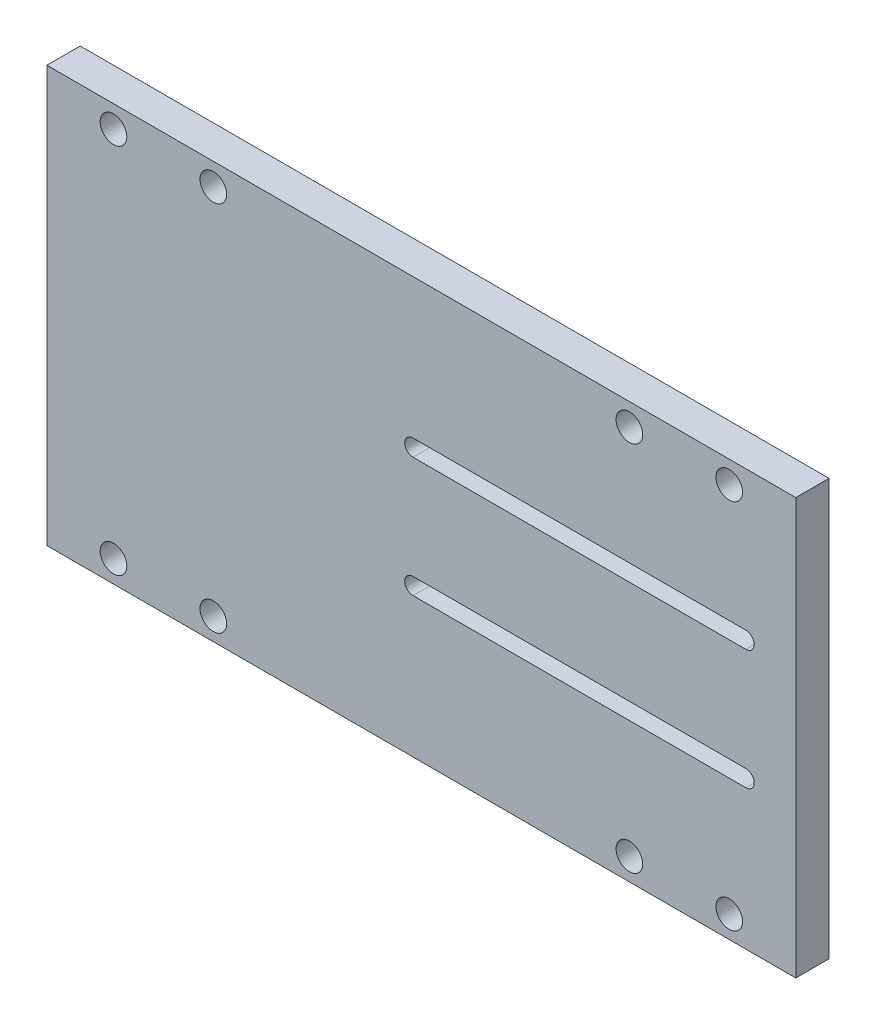
ISO-10303-21;
HEADER;
FILE_DESCRIPTION(('STEP AP214'),'2;1');
FILE_NAME('part.step','',(''),(''),'','','');
FILE_SCHEMA(('AUTOMOTIVE_DESIGN { 1 0 10303 214 1 1 1 1 }'));
ENDSEC;
DATA;
#1=APPLICATION_CONTEXT('core data for automotive mechanical design processes');
#2=APPLICATION_PROTOCOL_DEFINITION('international standard','automotive_design',2000,#1);
#3=PRODUCT_CONTEXT('',#1,'mechanical');
#4=PRODUCT('Part','Part','',(#3));
#5=PRODUCT_RELATED_PRODUCT_CATEGORY('part','',(#4));
#6=PRODUCT_DEFINITION_FORMATION('','',#4);
#7=PRODUCT_DEFINITION_CONTEXT('part definition',#1,'design');
#8=PRODUCT_DEFINITION('design','',#6,#7);
#9=PRODUCT_DEFINITION_SHAPE('','',#8);
#10=(LENGTH_UNIT() NAMED_UNIT(*) SI_UNIT(.MILLI.,.METRE.));
#11=(NAMED_UNIT(*) PLANE_ANGLE_UNIT() SI_UNIT($,.RADIAN.));
#12=(NAMED_UNIT(*) SI_UNIT($,.STERADIAN.) SOLID_ANGLE_UNIT());
#13=UNCERTAINTY_MEASURE_WITH_UNIT(LENGTH_MEASURE(1.E-05),#10,'distance_accuracy_value','');
#14=(GEOMETRIC_REPRESENTATION_CONTEXT(3) GLOBAL_UNCERTAINTY_ASSIGNED_CONTEXT((#13)) GLOBAL_UNIT_ASSIGNED_CONTEXT((#10,
#11,#12)) REPRESENTATION_CONTEXT('',''));
#15=CARTESIAN_POINT('',(0.,0.,0.));
#16=DIRECTION('',(0.,0.,1.));
#17=DIRECTION('',(1.,0.,0.));
#18=AXIS2_PLACEMENT_3D('',#15,#16,#17);
#19=CARTESIAN_POINT('',(0.,0.,5.08));
#20=DIRECTION('',(0.,0.,-1.));
#21=DIRECTION('',(-1.,0.,0.));
#22=AXIS2_PLACEMENT_3D('',#19,#20,#21);
#23=PLANE('',#22);
#24=DIRECTION('',(1.,0.,0.));
#25=VECTOR('',#24,1.);
#26=CARTESIAN_POINT('',(106.68,23.876,5.08));
#27=LINE('',#26,#25);
#28=CARTESIAN_POINT('',(55.88,23.876,5.08));
#29=VERTEX_POINT('',#28);
#30=CARTESIAN_POINT('',(106.68,23.876,5.08));
#31=VERTEX_POINT('',#30);
#32=EDGE_CURVE('E130',#29,#31,#27,.T.);
#33=ORIENTED_EDGE('',*,*,#32,.T.);
#34=CARTESIAN_POINT('',(106.68,22.606,5.08));
#35=DIRECTION('',(0.,0.,-1.));
#36=DIRECTION('',(1.,0.,0.));
#37=AXIS2_PLACEMENT_3D('',#34,#35,#36);
#38=CIRCLE('',#37,1.26999999999999);
#39=CARTESIAN_POINT('',(106.68,21.336,5.08));
#40=VERTEX_POINT('',#39);
#41=EDGE_CURVE('E124',#31,#40,#38,.T.);
#42=ORIENTED_EDGE('',*,*,#41,.T.);
#43=DIRECTION('',(-1.,0.,0.));
#44=VECTOR('',#43,1.);
#45=CARTESIAN_POINT('',(106.68,21.336,5.08));
#46=LINE('',#45,#44);
#47=CARTESIAN_POINT('',(55.88,21.336,5.08));
#48=VERTEX_POINT('',#47);
#49=EDGE_CURVE('E133',#40,#48,#46,.T.);
#50=ORIENTED_EDGE('',*,*,#49,.T.);
#51=CARTESIAN_POINT('',(55.88,22.606,5.08));
#52=DIRECTION('',(0.,0.,-1.));
#53=DIRECTION('',(-1.,0.,0.));
#54=AXIS2_PLACEMENT_3D('',#51,#52,#53);
#55=CIRCLE('',#54,1.26999999999999);
#56=EDGE_CURVE('E48',#48,#29,#55,.T.);
#57=ORIENTED_EDGE('',*,*,#56,.T.);
#58=EDGE_LOOP('',(#33,#42,#50,#57));
#59=FACE_BOUND('',#58,.T.);
#60=DIRECTION('',(1.,0.,0.));
#61=VECTOR('',#60,1.);
#62=CARTESIAN_POINT('',(106.68,42.164,5.08));
#63=LINE('',#62,#61);
#64=CARTESIAN_POINT('',(55.88,42.164,5.08));
#65=VERTEX_POINT('',#64);
#66=CARTESIAN_POINT('',(106.68,42.164,5.08));
#67=VERTEX_POINT('',#66);
#68=EDGE_CURVE('E168',#65,#67,#63,.T.);
#69=ORIENTED_EDGE('',*,*,#68,.T.);
#70=CARTESIAN_POINT('',(106.68,40.894,5.08));
#71=DIRECTION('',(0.,0.,-1.));
#72=DIRECTION('',(-1.,0.,0.));
#73=AXIS2_PLACEMENT_3D('',#70,#71,#72);
#74=CIRCLE('',#73,1.26999999999999);
#75=CARTESIAN_POINT('',(106.68,39.624,5.08));
#76=VERTEX_POINT('',#75);
#77=EDGE_CURVE('E158',#67,#76,#74,.T.);
#78=ORIENTED_EDGE('',*,*,#77,.T.);
#79=DIRECTION('',(-1.,0.,0.));
#80=VECTOR('',#79,1.);
#81=CARTESIAN_POINT('',(106.68,39.624,5.08));
#82=LINE('',#81,#80);
#83=CARTESIAN_POINT('',(55.88,39.624,5.08));
#84=VERTEX_POINT('',#83);
#85=EDGE_CURVE('E161',#76,#84,#82,.T.);
#86=ORIENTED_EDGE('',*,*,#85,.T.);
#87=CARTESIAN_POINT('',(55.88,40.894,5.08));
#88=DIRECTION('',(0.,0.,-1.));
#89=DIRECTION('',(1.,0.,0.));
#90=AXIS2_PLACEMENT_3D('',#87,#88,#89);
#91=CIRCLE('',#90,1.26999999999999);
#92=EDGE_CURVE('E165',#84,#65,#91,.T.);
#93=ORIENTED_EDGE('',*,*,#92,.T.);
#94=EDGE_LOOP('',(#69,#78,#86,#93));
#95=FACE_BOUND('',#94,.T.);
#96=CARTESIAN_POINT('',(104.14,3.37820000000003,5.08));
#97=DIRECTION('',(0.,0.,1.));
#98=DIRECTION('',(-1.,0.,0.));
#99=AXIS2_PLACEMENT_3D('',#96,#97,#98);
#100=CIRCLE('',#99,2.03200000000001);
#101=CARTESIAN_POINT('',(102.108,3.37820000000003,5.08));
#102=VERTEX_POINT('',#101);
#103=EDGE_CURVE('E196',#102,#102,#100,.T.);
#104=ORIENTED_EDGE('',*,*,#103,.F.);
#105=EDGE_LOOP('',(#104));
#106=FACE_BOUND('',#105,.T.);
#107=CARTESIAN_POINT('',(10.16,60.1218,5.08));
#108=DIRECTION('',(0.,0.,1.));
#109=DIRECTION('',(-1.,0.,0.));
#110=AXIS2_PLACEMENT_3D('',#107,#108,#109);
#111=CIRCLE('',#110,2.032);
#112=CARTESIAN_POINT('',(8.128,60.1218,5.08));
#113=VERTEX_POINT('',#112);
#114=EDGE_CURVE('E208',#113,#113,#111,.T.);
#115=ORIENTED_EDGE('',*,*,#114,.F.);
#116=EDGE_LOOP('',(#115));
#117=FACE_BOUND('',#116,.T.);
#118=CARTESIAN_POINT('',(25.4,3.37820000000003,5.08));
#119=DIRECTION('',(0.,0.,1.));
#120=DIRECTION('',(1.,0.,0.));
#121=AXIS2_PLACEMENT_3D('',#118,#119,#120);
#122=CIRCLE('',#121,2.03200000000001);
#123=CARTESIAN_POINT('',(27.432,3.37820000000003,5.08));
#124=VERTEX_POINT('',#123);
#125=EDGE_CURVE('E220',#124,#124,#122,.T.);
#126=ORIENTED_EDGE('',*,*,#125,.F.);
#127=EDGE_LOOP('',(#126));
#128=FACE_BOUND('',#127,.T.);
#129=CARTESIAN_POINT('',(88.9,60.1218,5.08));
#130=DIRECTION('',(0.,0.,1.));
#131=DIRECTION('',(1.,0.,0.));
#132=AXIS2_PLACEMENT_3D('',#129,#130,#131);
#133=CIRCLE('',#132,2.03200000000001);
#134=CARTESIAN_POINT('',(90.932,60.1218,5.08));
#135=VERTEX_POINT('',#134);
#136=EDGE_CURVE('E232',#135,#135,#133,.T.);
#137=ORIENTED_EDGE('',*,*,#136,.F.);
#138=EDGE_LOOP('',(#137));
#139=FACE_BOUND('',#138,.T.);
#140=DIRECTION('',(0.,-1.,0.));
#141=VECTOR('',#140,1.);
#142=CARTESIAN_POINT('',(0.,0.,5.08));
#143=LINE('',#142,#141);
#144=CARTESIAN_POINT('',(0.,63.5,5.08));
#145=VERTEX_POINT('',#144);
#146=CARTESIAN_POINT('',(0.,0.,5.08));
#147=VERTEX_POINT('',#146);
#148=EDGE_CURVE('E238',#145,#147,#143,.T.);
#149=ORIENTED_EDGE('',*,*,#148,.T.);
#150=DIRECTION('',(1.,0.,0.));
#151=VECTOR('',#150,1.);
#152=CARTESIAN_POINT('',(0.,0.,5.08));
#153=LINE('',#152,#151);
#154=CARTESIAN_POINT('',(114.3,0.,5.08));
#155=VERTEX_POINT('',#154);
#156=EDGE_CURVE('E241',#147,#155,#153,.T.);
#157=ORIENTED_EDGE('',*,*,#156,.T.);
#158=DIRECTION('',(0.,1.,0.));
#159=VECTOR('',#158,1.);
#160=CARTESIAN_POINT('',(114.3,0.,5.08));
#161=LINE('',#160,#159);
#162=CARTESIAN_POINT('',(114.3,63.5,5.08));
#163=VERTEX_POINT('',#162);
#164=EDGE_CURVE('E244',#155,#163,#161,.T.);
#165=ORIENTED_EDGE('',*,*,#164,.T.);
#166=DIRECTION('',(-1.,0.,0.));
#167=VECTOR('',#166,1.);
#168=CARTESIAN_POINT('',(0.,63.5,5.08));
#169=LINE('',#168,#167);
#170=EDGE_CURVE('E246',#163,#145,#169,.T.);
#171=ORIENTED_EDGE('',*,*,#170,.T.);
#172=EDGE_LOOP('',(#149,#157,#165,#171));
#173=FACE_BOUND('',#172,.T.);
#174=CARTESIAN_POINT('',(88.9,3.37820000000001,5.08));
#175=DIRECTION('',(0.,0.,1.));
#176=DIRECTION('',(-1.,0.,0.));
#177=AXIS2_PLACEMENT_3D('',#174,#175,#176);
#178=CIRCLE('',#177,2.03200000000001);
#179=CARTESIAN_POINT('',(86.868,3.37820000000001,5.08));
#180=VERTEX_POINT('',#179);
#181=EDGE_CURVE('E226',#180,#180,#178,.T.);
#182=ORIENTED_EDGE('',*,*,#181,.F.);
#183=EDGE_LOOP('',(#182));
#184=FACE_BOUND('',#183,.T.);
#185=CARTESIAN_POINT('',(25.4,60.1218,5.08));
#186=DIRECTION('',(0.,0.,1.));
#187=DIRECTION('',(-1.,0.,0.));
#188=AXIS2_PLACEMENT_3D('',#185,#186,#187);
#189=CIRCLE('',#188,2.03200000000001);
#190=CARTESIAN_POINT('',(23.368,60.1218,5.08));
#191=VERTEX_POINT('',#190);
#192=EDGE_CURVE('E214',#191,#191,#189,.T.);
#193=ORIENTED_EDGE('',*,*,#192,.F.);
#194=EDGE_LOOP('',(#193));
#195=FACE_BOUND('',#194,.T.);
#196=CARTESIAN_POINT('',(10.16,3.37820000000003,5.08));
#197=DIRECTION('',(0.,0.,1.));
#198=DIRECTION('',(1.,0.,0.));
#199=AXIS2_PLACEMENT_3D('',#196,#197,#198);
#200=CIRCLE('',#199,2.032);
#201=CARTESIAN_POINT('',(12.192,3.37820000000003,5.08));
#202=VERTEX_POINT('',#201);
#203=EDGE_CURVE('E202',#202,#202,#200,.T.);
#204=ORIENTED_EDGE('',*,*,#203,.F.);
#205=EDGE_LOOP('',(#204));
#206=FACE_BOUND('',#205,.T.);
#207=CARTESIAN_POINT('',(104.14,60.1218,5.08));
#208=DIRECTION('',(0.,0.,1.));
#209=DIRECTION('',(1.,0.,0.));
#210=AXIS2_PLACEMENT_3D('',#207,#208,#209);
#211=CIRCLE('',#210,2.03200000000001);
#212=CARTESIAN_POINT('',(106.172,60.1218,5.08));
#213=VERTEX_POINT('',#212);
#214=EDGE_CURVE('E190',#213,#213,#211,.T.);
#215=ORIENTED_EDGE('',*,*,#214,.F.);
#216=EDGE_LOOP('',(#215));
#217=FACE_BOUND('',#216,.T.);
#218=ADVANCED_FACE('F33',(#59,#95,#106,#117,#128,#139,#173,#184,#195,#206,#217),#23,.F.);
#219=CARTESIAN_POINT('',(0.,0.,0.));
#220=DIRECTION('',(0.,0.,-1.));
#221=DIRECTION('',(-1.,0.,0.));
#222=AXIS2_PLACEMENT_3D('',#219,#220,#221);
#223=PLANE('',#222);
#224=CARTESIAN_POINT('',(106.68,22.606,0.));
#225=DIRECTION('',(0.,0.,-1.));
#226=DIRECTION('',(1.,0.,0.));
#227=AXIS2_PLACEMENT_3D('',#224,#225,#226);
#228=CIRCLE('',#227,1.26999999999999);
#229=CARTESIAN_POINT('',(106.68,23.876,0.));
#230=VERTEX_POINT('',#229);
#231=CARTESIAN_POINT('',(106.68,21.336,0.));
#232=VERTEX_POINT('',#231);
#233=EDGE_CURVE('E56',#230,#232,#228,.T.);
#234=ORIENTED_EDGE('',*,*,#233,.F.);
#235=DIRECTION('',(1.,0.,0.));
#236=VECTOR('',#235,1.);
#237=CARTESIAN_POINT('',(106.68,23.876,0.));
#238=LINE('',#237,#236);
#239=CARTESIAN_POINT('',(55.88,23.876,0.));
#240=VERTEX_POINT('',#239);
#241=EDGE_CURVE('E139',#240,#230,#238,.T.);
#242=ORIENTED_EDGE('',*,*,#241,.F.);
#243=CARTESIAN_POINT('',(55.88,22.606,0.));
#244=DIRECTION('',(0.,0.,-1.));
#245=DIRECTION('',(-1.,0.,0.));
#246=AXIS2_PLACEMENT_3D('',#243,#244,#245);
#247=CIRCLE('',#246,1.26999999999999);
#248=CARTESIAN_POINT('',(55.88,21.336,0.));
#249=VERTEX_POINT('',#248);
#250=EDGE_CURVE('E142',#249,#240,#247,.T.);
#251=ORIENTED_EDGE('',*,*,#250,.F.);
#252=DIRECTION('',(-1.,0.,0.));
#253=VECTOR('',#252,1.);
#254=CARTESIAN_POINT('',(106.68,21.336,0.));
#255=LINE('',#254,#253);
#256=EDGE_CURVE('E148',#232,#249,#255,.T.);
#257=ORIENTED_EDGE('',*,*,#256,.F.);
#258=EDGE_LOOP('',(#234,#242,#251,#257));
#259=FACE_BOUND('',#258,.T.);
#260=CARTESIAN_POINT('',(106.68,40.894,0.));
#261=DIRECTION('',(0.,0.,-1.));
#262=DIRECTION('',(-1.,0.,0.));
#263=AXIS2_PLACEMENT_3D('',#260,#261,#262);
#264=CIRCLE('',#263,1.26999999999999);
#265=CARTESIAN_POINT('',(106.68,42.164,0.));
#266=VERTEX_POINT('',#265);
#267=CARTESIAN_POINT('',(106.68,39.624,0.));
#268=VERTEX_POINT('',#267);
#269=EDGE_CURVE('E154',#266,#268,#264,.T.);
#270=ORIENTED_EDGE('',*,*,#269,.F.);
#271=DIRECTION('',(1.,0.,0.));
#272=VECTOR('',#271,1.);
#273=CARTESIAN_POINT('',(106.68,42.164,0.));
#274=LINE('',#273,#272);
#275=CARTESIAN_POINT('',(55.88,42.164,0.));
#276=VERTEX_POINT('',#275);
#277=EDGE_CURVE('E162',#276,#266,#274,.T.);
#278=ORIENTED_EDGE('',*,*,#277,.F.);
#279=CARTESIAN_POINT('',(55.88,40.894,0.));
#280=DIRECTION('',(0.,0.,-1.));
#281=DIRECTION('',(1.,0.,0.));
#282=AXIS2_PLACEMENT_3D('',#279,#280,#281);
#283=CIRCLE('',#282,1.26999999999999);
#284=CARTESIAN_POINT('',(55.88,39.624,0.));
#285=VERTEX_POINT('',#284);
#286=EDGE_CURVE('E176',#285,#276,#283,.T.);
#287=ORIENTED_EDGE('',*,*,#286,.F.);
#288=DIRECTION('',(-1.,0.,0.));
#289=VECTOR('',#288,1.);
#290=CARTESIAN_POINT('',(106.68,39.624,0.));
#291=LINE('',#290,#289);
#292=EDGE_CURVE('E173',#268,#285,#291,.T.);
#293=ORIENTED_EDGE('',*,*,#292,.F.);
#294=EDGE_LOOP('',(#270,#278,#287,#293));
#295=FACE_BOUND('',#294,.T.);
#296=CARTESIAN_POINT('',(104.14,3.37820000000003,0.));
#297=DIRECTION('',(0.,0.,1.));
#298=DIRECTION('',(-1.,0.,0.));
#299=AXIS2_PLACEMENT_3D('',#296,#297,#298);
#300=CIRCLE('',#299,2.03200000000001);
#301=CARTESIAN_POINT('',(102.108,3.37820000000003,0.));
#302=VERTEX_POINT('',#301);
#303=EDGE_CURVE('E193',#302,#302,#300,.T.);
#304=ORIENTED_EDGE('',*,*,#303,.T.);
#305=EDGE_LOOP('',(#304));
#306=FACE_BOUND('',#305,.T.);
#307=CARTESIAN_POINT('',(10.16,60.1218,0.));
#308=DIRECTION('',(0.,0.,1.));
#309=DIRECTION('',(-1.,0.,0.));
#310=AXIS2_PLACEMENT_3D('',#307,#308,#309);
#311=CIRCLE('',#310,2.032);
#312=CARTESIAN_POINT('',(8.128,60.1218,0.));
#313=VERTEX_POINT('',#312);
#314=EDGE_CURVE('E205',#313,#313,#311,.T.);
#315=ORIENTED_EDGE('',*,*,#314,.T.);
#316=EDGE_LOOP('',(#315));
#317=FACE_BOUND('',#316,.T.);
#318=CARTESIAN_POINT('',(25.4,3.37820000000003,0.));
#319=DIRECTION('',(0.,0.,1.));
#320=DIRECTION('',(1.,0.,0.));
#321=AXIS2_PLACEMENT_3D('',#318,#319,#320);
#322=CIRCLE('',#321,2.03200000000001);
#323=CARTESIAN_POINT('',(27.432,3.37820000000003,0.));
#324=VERTEX_POINT('',#323);
#325=EDGE_CURVE('E217',#324,#324,#322,.T.);
#326=ORIENTED_EDGE('',*,*,#325,.T.);
#327=EDGE_LOOP('',(#326));
#328=FACE_BOUND('',#327,.T.);
#329=CARTESIAN_POINT('',(88.9,60.1218,0.));
#330=DIRECTION('',(0.,0.,1.));
#331=DIRECTION('',(1.,0.,0.));
#332=AXIS2_PLACEMENT_3D('',#329,#330,#331);
#333=CIRCLE('',#332,2.03200000000001);
#334=CARTESIAN_POINT('',(90.932,60.1218,0.));
#335=VERTEX_POINT('',#334);
#336=EDGE_CURVE('E229',#335,#335,#333,.T.);
#337=ORIENTED_EDGE('',*,*,#336,.T.);
#338=EDGE_LOOP('',(#337));
#339=FACE_BOUND('',#338,.T.);
#340=DIRECTION('',(0.,-1.,0.));
#341=VECTOR('',#340,1.);
#342=CARTESIAN_POINT('',(0.,0.,0.));
#343=LINE('',#342,#341);
#344=CARTESIAN_POINT('',(0.,63.5,0.));
#345=VERTEX_POINT('',#344);
#346=CARTESIAN_POINT('',(0.,0.,0.));
#347=VERTEX_POINT('',#346);
#348=EDGE_CURVE('E235',#345,#347,#343,.T.);
#349=ORIENTED_EDGE('',*,*,#348,.F.);
#350=DIRECTION('',(-1.,0.,0.));
#351=VECTOR('',#350,1.);
#352=CARTESIAN_POINT('',(0.,63.5,0.));
#353=LINE('',#352,#351);
#354=CARTESIAN_POINT('',(114.3,63.5,0.));
#355=VERTEX_POINT('',#354);
#356=EDGE_CURVE('E242',#355,#345,#353,.T.);
#357=ORIENTED_EDGE('',*,*,#356,.F.);
#358=DIRECTION('',(0.,1.,0.));
#359=VECTOR('',#358,1.);
#360=CARTESIAN_POINT('',(114.3,0.,0.));
#361=LINE('',#360,#359);
#362=CARTESIAN_POINT('',(114.3,0.,0.));
#363=VERTEX_POINT('',#362);
#364=EDGE_CURVE('E253',#363,#355,#361,.T.);
#365=ORIENTED_EDGE('',*,*,#364,.F.);
#366=DIRECTION('',(1.,0.,0.));
#367=VECTOR('',#366,1.);
#368=CARTESIAN_POINT('',(0.,0.,0.));
#369=LINE('',#368,#367);
#370=EDGE_CURVE('E251',#347,#363,#369,.T.);
#371=ORIENTED_EDGE('',*,*,#370,.F.);
#372=EDGE_LOOP('',(#349,#357,#365,#371));
#373=FACE_BOUND('',#372,.T.);
#374=CARTESIAN_POINT('',(88.9,3.37820000000001,0.));
#375=DIRECTION('',(0.,0.,1.));
#376=DIRECTION('',(-1.,0.,0.));
#377=AXIS2_PLACEMENT_3D('',#374,#375,#376);
#378=CIRCLE('',#377,2.03200000000001);
#379=CARTESIAN_POINT('',(86.868,3.37820000000001,0.));
#380=VERTEX_POINT('',#379);
#381=EDGE_CURVE('E223',#380,#380,#378,.T.);
#382=ORIENTED_EDGE('',*,*,#381,.T.);
#383=EDGE_LOOP('',(#382));
#384=FACE_BOUND('',#383,.T.);
#385=CARTESIAN_POINT('',(25.4,60.1218,0.));
#386=DIRECTION('',(0.,0.,1.));
#387=DIRECTION('',(-1.,0.,0.));
#388=AXIS2_PLACEMENT_3D('',#385,#386,#387);
#389=CIRCLE('',#388,2.03200000000001);
#390=CARTESIAN_POINT('',(23.368,60.1218,0.));
#391=VERTEX_POINT('',#390);
#392=EDGE_CURVE('E211',#391,#391,#389,.T.);
#393=ORIENTED_EDGE('',*,*,#392,.T.);
#394=EDGE_LOOP('',(#393));
#395=FACE_BOUND('',#394,.T.);
#396=CARTESIAN_POINT('',(10.16,3.37820000000003,0.));
#397=DIRECTION('',(0.,0.,1.));
#398=DIRECTION('',(1.,0.,0.));
#399=AXIS2_PLACEMENT_3D('',#396,#397,#398);
#400=CIRCLE('',#399,2.032);
#401=CARTESIAN_POINT('',(12.192,3.37820000000003,0.));
#402=VERTEX_POINT('',#401);
#403=EDGE_CURVE('E199',#402,#402,#400,.T.);
#404=ORIENTED_EDGE('',*,*,#403,.T.);
#405=EDGE_LOOP('',(#404));
#406=FACE_BOUND('',#405,.T.);
#407=CARTESIAN_POINT('',(104.14,60.1218,0.));
#408=DIRECTION('',(0.,0.,1.));
#409=DIRECTION('',(1.,0.,0.));
#410=AXIS2_PLACEMENT_3D('',#407,#408,#409);
#411=CIRCLE('',#410,2.03200000000001);
#412=CARTESIAN_POINT('',(106.172,60.1218,0.));
#413=VERTEX_POINT('',#412);
#414=EDGE_CURVE('E183',#413,#413,#411,.T.);
#415=ORIENTED_EDGE('',*,*,#414,.T.);
#416=EDGE_LOOP('',(#415));
#417=FACE_BOUND('',#416,.T.);
#418=ADVANCED_FACE('F271',(#259,#295,#306,#317,#328,#339,#373,#384,#395,#406,#417),#223,.T.);
#419=CARTESIAN_POINT('',(0.,0.,5.08));
#420=DIRECTION('',(1.,0.,0.));
#421=DIRECTION('',(0.,0.,-1.));
#422=AXIS2_PLACEMENT_3D('',#419,#420,#421);
#423=PLANE('',#422);
#424=ORIENTED_EDGE('',*,*,#348,.T.);
#425=DIRECTION('',(0.,0.,-1.));
#426=VECTOR('',#425,1.);
#427=CARTESIAN_POINT('',(0.,0.,5.08));
#428=LINE('',#427,#426);
#429=EDGE_CURVE('E11',#147,#347,#428,.T.);
#430=ORIENTED_EDGE('',*,*,#429,.F.);
#431=ORIENTED_EDGE('',*,*,#148,.F.);
#432=DIRECTION('',(0.,0.,-1.));
#433=VECTOR('',#432,1.);
#434=CARTESIAN_POINT('',(0.,63.5,5.08));
#435=LINE('',#434,#433);
#436=EDGE_CURVE('E248',#145,#345,#435,.T.);
#437=ORIENTED_EDGE('',*,*,#436,.T.);
#438=EDGE_LOOP('',(#424,#430,#431,#437));
#439=FACE_BOUND('',#438,.T.);
#440=ADVANCED_FACE('F35',(#439),#423,.F.);
#441=CARTESIAN_POINT('',(0.,0.,5.08));
#442=DIRECTION('',(0.,1.,0.));
#443=DIRECTION('',(0.,0.,1.));
#444=AXIS2_PLACEMENT_3D('',#441,#442,#443);
#445=PLANE('',#444);
#446=ORIENTED_EDGE('',*,*,#370,.T.);
#447=DIRECTION('',(0.,0.,-1.));
#448=VECTOR('',#447,1.);
#449=CARTESIAN_POINT('',(114.3,0.,5.08));
#450=LINE('',#449,#448);
#451=EDGE_CURVE('E41',#155,#363,#450,.T.);
#452=ORIENTED_EDGE('',*,*,#451,.F.);
#453=ORIENTED_EDGE('',*,*,#156,.F.);
#454=ORIENTED_EDGE('',*,*,#429,.T.);
#455=EDGE_LOOP('',(#446,#452,#453,#454));
#456=FACE_BOUND('',#455,.T.);
#457=ADVANCED_FACE('F282',(#456),#445,.F.);
#458=CARTESIAN_POINT('',(114.3,0.,5.08));
#459=DIRECTION('',(-1.,0.,0.));
#460=DIRECTION('',(0.,0.,1.));
#461=AXIS2_PLACEMENT_3D('',#458,#459,#460);
#462=PLANE('',#461);
#463=ORIENTED_EDGE('',*,*,#364,.T.);
#464=DIRECTION('',(0.,0.,-1.));
#465=VECTOR('',#464,1.);
#466=CARTESIAN_POINT('',(114.3,63.5,5.08));
#467=LINE('',#466,#465);
#468=EDGE_CURVE('E258',#163,#355,#467,.T.);
#469=ORIENTED_EDGE('',*,*,#468,.F.);
#470=ORIENTED_EDGE('',*,*,#164,.F.);
#471=ORIENTED_EDGE('',*,*,#451,.T.);
#472=EDGE_LOOP('',(#463,#469,#470,#471));
#473=FACE_BOUND('',#472,.T.);
#474=ADVANCED_FACE('F265',(#473),#462,.F.);
#475=CARTESIAN_POINT('',(0.,63.5,5.08));
#476=DIRECTION('',(0.,-1.,0.));
#477=DIRECTION('',(0.,0.,-1.));
#478=AXIS2_PLACEMENT_3D('',#475,#476,#477);
#479=PLANE('',#478);
#480=ORIENTED_EDGE('',*,*,#356,.T.);
#481=ORIENTED_EDGE('',*,*,#436,.F.);
#482=ORIENTED_EDGE('',*,*,#170,.F.);
#483=ORIENTED_EDGE('',*,*,#468,.T.);
#484=EDGE_LOOP('',(#480,#481,#482,#483));
#485=FACE_BOUND('',#484,.T.);
#486=ADVANCED_FACE('F275',(#485),#479,.F.);
#487=CARTESIAN_POINT('',(88.9,60.1218,5.08));
#488=DIRECTION('',(0.,0.,-1.));
#489=DIRECTION('',(-1.,0.,0.));
#490=AXIS2_PLACEMENT_3D('',#487,#488,#489);
#491=CYLINDRICAL_SURFACE('',#490,2.03200000000001);
#492=ORIENTED_EDGE('',*,*,#136,.T.);
#493=EDGE_LOOP('',(#492));
#494=FACE_BOUND('',#493,.T.);
#495=ORIENTED_EDGE('',*,*,#336,.F.);
#496=EDGE_LOOP('',(#495));
#497=FACE_BOUND('',#496,.T.);
#498=ADVANCED_FACE('F297',(#494,#497),#491,.F.);
#499=CARTESIAN_POINT('',(88.9,3.37820000000001,5.08));
#500=DIRECTION('',(0.,0.,-1.));
#501=DIRECTION('',(-1.,0.,0.));
#502=AXIS2_PLACEMENT_3D('',#499,#500,#501);
#503=CYLINDRICAL_SURFACE('',#502,2.03200000000001);
#504=ORIENTED_EDGE('',*,*,#181,.T.);
#505=EDGE_LOOP('',(#504));
#506=FACE_BOUND('',#505,.T.);
#507=ORIENTED_EDGE('',*,*,#381,.F.);
#508=EDGE_LOOP('',(#507));
#509=FACE_BOUND('',#508,.T.);
#510=ADVANCED_FACE('F304',(#506,#509),#503,.F.);
#511=CARTESIAN_POINT('',(25.4,3.37820000000003,5.08));
#512=DIRECTION('',(0.,0.,-1.));
#513=DIRECTION('',(-1.,0.,0.));
#514=AXIS2_PLACEMENT_3D('',#511,#512,#513);
#515=CYLINDRICAL_SURFACE('',#514,2.03200000000001);
#516=ORIENTED_EDGE('',*,*,#125,.T.);
#517=EDGE_LOOP('',(#516));
#518=FACE_BOUND('',#517,.T.);
#519=ORIENTED_EDGE('',*,*,#325,.F.);
#520=EDGE_LOOP('',(#519));
#521=FACE_BOUND('',#520,.T.);
#522=ADVANCED_FACE('F309',(#518,#521),#515,.F.);
#523=CARTESIAN_POINT('',(25.4,60.1218,5.08));
#524=DIRECTION('',(0.,0.,-1.));
#525=DIRECTION('',(-1.,0.,0.));
#526=AXIS2_PLACEMENT_3D('',#523,#524,#525);
#527=CYLINDRICAL_SURFACE('',#526,2.03200000000001);
#528=ORIENTED_EDGE('',*,*,#192,.T.);
#529=EDGE_LOOP('',(#528));
#530=FACE_BOUND('',#529,.T.);
#531=ORIENTED_EDGE('',*,*,#392,.F.);
#532=EDGE_LOOP('',(#531));
#533=FACE_BOUND('',#532,.T.);
#534=ADVANCED_FACE('F319',(#530,#533),#527,.F.);
#535=CARTESIAN_POINT('',(10.16,60.1218,5.08));
#536=DIRECTION('',(0.,0.,-1.));
#537=DIRECTION('',(-1.,0.,0.));
#538=AXIS2_PLACEMENT_3D('',#535,#536,#537);
#539=CYLINDRICAL_SURFACE('',#538,2.032);
#540=ORIENTED_EDGE('',*,*,#114,.T.);
#541=EDGE_LOOP('',(#540));
#542=FACE_BOUND('',#541,.T.);
#543=ORIENTED_EDGE('',*,*,#314,.F.);
#544=EDGE_LOOP('',(#543));
#545=FACE_BOUND('',#544,.T.);
#546=ADVANCED_FACE('F326',(#542,#545),#539,.F.);
#547=CARTESIAN_POINT('',(10.16,3.37820000000003,5.08));
#548=DIRECTION('',(0.,0.,-1.));
#549=DIRECTION('',(-1.,0.,0.));
#550=AXIS2_PLACEMENT_3D('',#547,#548,#549);
#551=CYLINDRICAL_SURFACE('',#550,2.032);
#552=ORIENTED_EDGE('',*,*,#203,.T.);
#553=EDGE_LOOP('',(#552));
#554=FACE_BOUND('',#553,.T.);
#555=ORIENTED_EDGE('',*,*,#403,.F.);
#556=EDGE_LOOP('',(#555));
#557=FACE_BOUND('',#556,.T.);
#558=ADVANCED_FACE('F330',(#554,#557),#551,.F.);
#559=CARTESIAN_POINT('',(104.14,3.37820000000003,5.08));
#560=DIRECTION('',(0.,0.,-1.));
#561=DIRECTION('',(-1.,0.,0.));
#562=AXIS2_PLACEMENT_3D('',#559,#560,#561);
#563=CYLINDRICAL_SURFACE('',#562,2.03200000000001);
#564=ORIENTED_EDGE('',*,*,#103,.T.);
#565=EDGE_LOOP('',(#564));
#566=FACE_BOUND('',#565,.T.);
#567=ORIENTED_EDGE('',*,*,#303,.F.);
#568=EDGE_LOOP('',(#567));
#569=FACE_BOUND('',#568,.T.);
#570=ADVANCED_FACE('F334',(#566,#569),#563,.F.);
#571=CARTESIAN_POINT('',(104.14,60.1218,5.08));
#572=DIRECTION('',(0.,0.,-1.));
#573=DIRECTION('',(-1.,0.,0.));
#574=AXIS2_PLACEMENT_3D('',#571,#572,#573);
#575=CYLINDRICAL_SURFACE('',#574,2.03200000000001);
#576=ORIENTED_EDGE('',*,*,#214,.T.);
#577=EDGE_LOOP('',(#576));
#578=FACE_BOUND('',#577,.T.);
#579=ORIENTED_EDGE('',*,*,#414,.F.);
#580=EDGE_LOOP('',(#579));
#581=FACE_BOUND('',#580,.T.);
#582=ADVANCED_FACE('F338',(#578,#581),#575,.F.);
#583=CARTESIAN_POINT('',(106.68,40.894,5.08));
#584=DIRECTION('',(0.,0.,-1.));
#585=DIRECTION('',(-1.,0.,0.));
#586=AXIS2_PLACEMENT_3D('',#583,#584,#585);
#587=CYLINDRICAL_SURFACE('',#586,1.26999999999999);
#588=ORIENTED_EDGE('',*,*,#269,.T.);
#589=DIRECTION('',(0.,0.,-1.));
#590=VECTOR('',#589,1.);
#591=CARTESIAN_POINT('',(106.68,39.624,5.08));
#592=LINE('',#591,#590);
#593=EDGE_CURVE('E171',#76,#268,#592,.T.);
#594=ORIENTED_EDGE('',*,*,#593,.F.);
#595=ORIENTED_EDGE('',*,*,#77,.F.);
#596=DIRECTION('',(0.,0.,-1.));
#597=VECTOR('',#596,1.);
#598=CARTESIAN_POINT('',(106.68,42.164,5.08));
#599=LINE('',#598,#597);
#600=EDGE_CURVE('E181',#67,#266,#599,.T.);
#601=ORIENTED_EDGE('',*,*,#600,.T.);
#602=EDGE_LOOP('',(#588,#594,#595,#601));
#603=FACE_BOUND('',#602,.T.);
#604=ADVANCED_FACE('F342',(#603),#587,.F.);
#605=CARTESIAN_POINT('',(106.68,42.164,5.08));
#606=DIRECTION('',(0.,1.,0.));
#607=DIRECTION('',(-1.,0.,0.));
#608=AXIS2_PLACEMENT_3D('',#605,#606,#607);
#609=PLANE('',#608);
#610=ORIENTED_EDGE('',*,*,#277,.T.);
#611=ORIENTED_EDGE('',*,*,#600,.F.);
#612=ORIENTED_EDGE('',*,*,#68,.F.);
#613=DIRECTION('',(0.,0.,-1.));
#614=VECTOR('',#613,1.);
#615=CARTESIAN_POINT('',(55.88,42.164,5.08));
#616=LINE('',#615,#614);
#617=EDGE_CURVE('E184',#65,#276,#616,.T.);
#618=ORIENTED_EDGE('',*,*,#617,.T.);
#619=EDGE_LOOP('',(#610,#611,#612,#618));
#620=FACE_BOUND('',#619,.T.);
#621=ADVANCED_FACE('F346',(#620),#609,.F.);
#622=CARTESIAN_POINT('',(55.88,40.894,5.08));
#623=DIRECTION('',(0.,0.,-1.));
#624=DIRECTION('',(-1.,0.,0.));
#625=AXIS2_PLACEMENT_3D('',#622,#623,#624);
#626=CYLINDRICAL_SURFACE('',#625,1.26999999999999);
#627=ORIENTED_EDGE('',*,*,#286,.T.);
#628=ORIENTED_EDGE('',*,*,#617,.F.);
#629=ORIENTED_EDGE('',*,*,#92,.F.);
#630=DIRECTION('',(0.,0.,-1.));
#631=VECTOR('',#630,1.);
#632=CARTESIAN_POINT('',(55.88,39.624,5.08));
#633=LINE('',#632,#631);
#634=EDGE_CURVE('E186',#84,#285,#633,.T.);
#635=ORIENTED_EDGE('',*,*,#634,.T.);
#636=EDGE_LOOP('',(#627,#628,#629,#635));
#637=FACE_BOUND('',#636,.T.);
#638=ADVANCED_FACE('F351',(#637),#626,.F.);
#639=CARTESIAN_POINT('',(106.68,39.624,5.08));
#640=DIRECTION('',(0.,-1.,0.));
#641=DIRECTION('',(1.,0.,0.));
#642=AXIS2_PLACEMENT_3D('',#639,#640,#641);
#643=PLANE('',#642);
#644=ORIENTED_EDGE('',*,*,#292,.T.);
#645=ORIENTED_EDGE('',*,*,#634,.F.);
#646=ORIENTED_EDGE('',*,*,#85,.F.);
#647=ORIENTED_EDGE('',*,*,#593,.T.);
#648=EDGE_LOOP('',(#644,#645,#646,#647));
#649=FACE_BOUND('',#648,.T.);
#650=ADVANCED_FACE('F348',(#649),#643,.F.);
#651=CARTESIAN_POINT('',(106.68,22.606,5.08));
#652=DIRECTION('',(0.,0.,-1.));
#653=DIRECTION('',(-1.,0.,0.));
#654=AXIS2_PLACEMENT_3D('',#651,#652,#653);
#655=CYLINDRICAL_SURFACE('',#654,1.26999999999999);
#656=ORIENTED_EDGE('',*,*,#233,.T.);
#657=DIRECTION('',(0.,0.,-1.));
#658=VECTOR('',#657,1.);
#659=CARTESIAN_POINT('',(106.68,21.336,5.08));
#660=LINE('',#659,#658);
#661=EDGE_CURVE('E120',#40,#232,#660,.T.);
#662=ORIENTED_EDGE('',*,*,#661,.F.);
#663=ORIENTED_EDGE('',*,*,#41,.F.);
#664=DIRECTION('',(0.,0.,-1.));
#665=VECTOR('',#664,1.);
#666=CARTESIAN_POINT('',(106.68,23.876,5.08));
#667=LINE('',#666,#665);
#668=EDGE_CURVE('E152',#31,#230,#667,.T.);
#669=ORIENTED_EDGE('',*,*,#668,.T.);
#670=EDGE_LOOP('',(#656,#662,#663,#669));
#671=FACE_BOUND('',#670,.T.);
#672=ADVANCED_FACE('F122',(#671),#655,.F.);
#673=CARTESIAN_POINT('',(106.68,23.876,5.08));
#674=DIRECTION('',(0.,1.,0.));
#675=DIRECTION('',(-1.,0.,0.));
#676=AXIS2_PLACEMENT_3D('',#673,#674,#675);
#677=PLANE('',#676);
#678=ORIENTED_EDGE('',*,*,#241,.T.);
#679=ORIENTED_EDGE('',*,*,#668,.F.);
#680=ORIENTED_EDGE('',*,*,#32,.F.);
#681=DIRECTION('',(0.,0.,-1.));
#682=VECTOR('',#681,1.);
#683=CARTESIAN_POINT('',(55.88,23.876,5.08));
#684=LINE('',#683,#682);
#685=EDGE_CURVE('E155',#29,#240,#684,.T.);
#686=ORIENTED_EDGE('',*,*,#685,.T.);
#687=EDGE_LOOP('',(#678,#679,#680,#686));
#688=FACE_BOUND('',#687,.T.);
#689=ADVANCED_FACE('F361',(#688),#677,.F.);
#690=CARTESIAN_POINT('',(55.88,22.606,5.08));
#691=DIRECTION('',(0.,0.,-1.));
#692=DIRECTION('',(-1.,0.,0.));
#693=AXIS2_PLACEMENT_3D('',#690,#691,#692);
#694=CYLINDRICAL_SURFACE('',#693,1.26999999999999);
#695=ORIENTED_EDGE('',*,*,#250,.T.);
#696=ORIENTED_EDGE('',*,*,#685,.F.);
#697=ORIENTED_EDGE('',*,*,#56,.F.);
#698=DIRECTION('',(0.,0.,-1.));
#699=VECTOR('',#698,1.);
#700=CARTESIAN_POINT('',(55.88,21.336,5.08));
#701=LINE('',#700,#699);
#702=EDGE_CURVE('E129',#48,#249,#701,.T.);
#703=ORIENTED_EDGE('',*,*,#702,.T.);
#704=EDGE_LOOP('',(#695,#696,#697,#703));
#705=FACE_BOUND('',#704,.T.);
#706=ADVANCED_FACE('F364',(#705),#694,.F.);
#707=CARTESIAN_POINT('',(106.68,21.336,5.08));
#708=DIRECTION('',(0.,-1.,0.));
#709=DIRECTION('',(1.,0.,0.));
#710=AXIS2_PLACEMENT_3D('',#707,#708,#709);
#711=PLANE('',#710);
#712=ORIENTED_EDGE('',*,*,#256,.T.);
#713=ORIENTED_EDGE('',*,*,#702,.F.);
#714=ORIENTED_EDGE('',*,*,#49,.F.);
#715=ORIENTED_EDGE('',*,*,#661,.T.);
#716=EDGE_LOOP('',(#712,#713,#714,#715));
#717=FACE_BOUND('',#716,.T.);
#718=ADVANCED_FACE('F134',(#717),#711,.F.);
#719=CLOSED_SHELL('',(#218,#418,#440,#457,#474,#486,#498,#510,#522,#534,#546,#558,#570,#582,
#604,#621,#638,#650,#672,#689,#706,#718));
#720=MANIFOLD_SOLID_BREP('B2',#719);
#721=ADVANCED_BREP_SHAPE_REPRESENTATION('',(#18,#720),#14);
#722=SHAPE_DEFINITION_REPRESENTATION(#9,#721);
ENDSEC;
END-ISO-10303-21;
